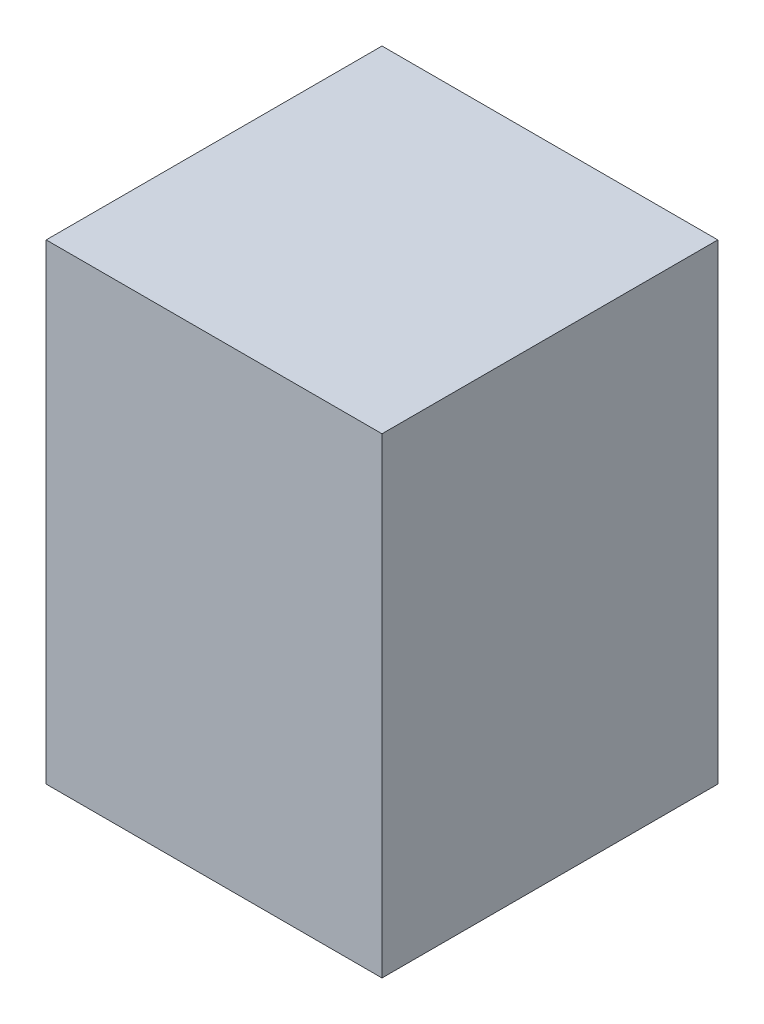
ISO-10303-21;
HEADER;
FILE_DESCRIPTION(('STEP AP214'),'2;1');
FILE_NAME('part.step','',(''),(''),'','','');
FILE_SCHEMA(('AUTOMOTIVE_DESIGN { 1 0 10303 214 1 1 1 1 }'));
ENDSEC;
DATA;
#1=APPLICATION_CONTEXT('core data for automotive mechanical design processes');
#2=APPLICATION_PROTOCOL_DEFINITION('international standard','automotive_design',2000,#1);
#3=PRODUCT_CONTEXT('',#1,'mechanical');
#4=PRODUCT('Part','Part','',(#3));
#5=PRODUCT_RELATED_PRODUCT_CATEGORY('part','',(#4));
#6=PRODUCT_DEFINITION_FORMATION('','',#4);
#7=PRODUCT_DEFINITION_CONTEXT('part definition',#1,'design');
#8=PRODUCT_DEFINITION('design','',#6,#7);
#9=PRODUCT_DEFINITION_SHAPE('','',#8);
#10=(LENGTH_UNIT() NAMED_UNIT(*) SI_UNIT(.MILLI.,.METRE.));
#11=(NAMED_UNIT(*) PLANE_ANGLE_UNIT() SI_UNIT($,.RADIAN.));
#12=(NAMED_UNIT(*) SI_UNIT($,.STERADIAN.) SOLID_ANGLE_UNIT());
#13=UNCERTAINTY_MEASURE_WITH_UNIT(LENGTH_MEASURE(1.E-05),#10,'distance_accuracy_value','');
#14=(GEOMETRIC_REPRESENTATION_CONTEXT(3) GLOBAL_UNCERTAINTY_ASSIGNED_CONTEXT((#13)) GLOBAL_UNIT_ASSIGNED_CONTEXT((#10,
#11,#12)) REPRESENTATION_CONTEXT('',''));
#15=CARTESIAN_POINT('',(0.,0.,0.));
#16=DIRECTION('',(0.,0.,1.));
#17=DIRECTION('',(1.,0.,0.));
#18=AXIS2_PLACEMENT_3D('',#15,#16,#17);
#19=CARTESIAN_POINT('',(322.,300.,-430.));
#20=DIRECTION('',(-1.,0.,0.));
#21=DIRECTION('',(0.,0.,1.));
#22=AXIS2_PLACEMENT_3D('',#19,#20,#21);
#23=PLANE('',#22);
#24=DIRECTION('',(0.,-1.,0.));
#25=VECTOR('',#24,1.);
#26=CARTESIAN_POINT('',(322.,300.,-373.));
#27=LINE('',#26,#25);
#28=CARTESIAN_POINT('',(322.,380.,-373.));
#29=VERTEX_POINT('',#28);
#30=CARTESIAN_POINT('',(322.,300.,-373.));
#31=VERTEX_POINT('',#30);
#32=EDGE_CURVE('E103',#29,#31,#27,.T.);
#33=ORIENTED_EDGE('',*,*,#32,.F.);
#34=DIRECTION('',(0.,0.,1.));
#35=VECTOR('',#34,1.);
#36=CARTESIAN_POINT('',(322.,380.,-430.));
#37=LINE('',#36,#35);
#38=CARTESIAN_POINT('',(322.,380.,-430.));
#39=VERTEX_POINT('',#38);
#40=EDGE_CURVE('E11',#39,#29,#37,.T.);
#41=ORIENTED_EDGE('',*,*,#40,.F.);
#42=DIRECTION('',(0.,-1.,0.));
#43=VECTOR('',#42,1.);
#44=CARTESIAN_POINT('',(322.,300.,-430.));
#45=LINE('',#44,#43);
#46=CARTESIAN_POINT('',(322.,300.,-430.));
#47=VERTEX_POINT('',#46);
#48=EDGE_CURVE('E97',#39,#47,#45,.T.);
#49=ORIENTED_EDGE('',*,*,#48,.T.);
#50=DIRECTION('',(0.,0.,1.));
#51=VECTOR('',#50,1.);
#52=CARTESIAN_POINT('',(322.,300.,-430.));
#53=LINE('',#52,#51);
#54=EDGE_CURVE('E42',#47,#31,#53,.T.);
#55=ORIENTED_EDGE('',*,*,#54,.T.);
#56=EDGE_LOOP('',(#33,#41,#49,#55));
#57=FACE_BOUND('',#56,.T.);
#58=ADVANCED_FACE('F39',(#57),#23,.T.);
#59=CARTESIAN_POINT('',(322.,380.,-430.));
#60=DIRECTION('',(0.,1.,0.));
#61=DIRECTION('',(0.,0.,1.));
#62=AXIS2_PLACEMENT_3D('',#59,#60,#61);
#63=PLANE('',#62);
#64=DIRECTION('',(-1.,0.,0.));
#65=VECTOR('',#64,1.);
#66=CARTESIAN_POINT('',(322.,380.,-373.));
#67=LINE('',#66,#65);
#68=CARTESIAN_POINT('',(379.,380.,-373.));
#69=VERTEX_POINT('',#68);
#70=EDGE_CURVE('E99',#69,#29,#67,.T.);
#71=ORIENTED_EDGE('',*,*,#70,.F.);
#72=DIRECTION('',(0.,0.,1.));
#73=VECTOR('',#72,1.);
#74=CARTESIAN_POINT('',(379.,380.,-430.));
#75=LINE('',#74,#73);
#76=CARTESIAN_POINT('',(379.,380.,-430.));
#77=VERTEX_POINT('',#76);
#78=EDGE_CURVE('E48',#77,#69,#75,.T.);
#79=ORIENTED_EDGE('',*,*,#78,.F.);
#80=DIRECTION('',(-1.,0.,0.));
#81=VECTOR('',#80,1.);
#82=CARTESIAN_POINT('',(322.,380.,-430.));
#83=LINE('',#82,#81);
#84=EDGE_CURVE('E94',#77,#39,#83,.T.);
#85=ORIENTED_EDGE('',*,*,#84,.T.);
#86=ORIENTED_EDGE('',*,*,#40,.T.);
#87=EDGE_LOOP('',(#71,#79,#85,#86));
#88=FACE_BOUND('',#87,.T.);
#89=ADVANCED_FACE('F113',(#88),#63,.T.);
#90=CARTESIAN_POINT('',(379.,300.,-430.));
#91=DIRECTION('',(1.,0.,0.));
#92=DIRECTION('',(0.,0.,-1.));
#93=AXIS2_PLACEMENT_3D('',#90,#91,#92);
#94=PLANE('',#93);
#95=DIRECTION('',(0.,1.,0.));
#96=VECTOR('',#95,1.);
#97=CARTESIAN_POINT('',(379.,300.,-373.));
#98=LINE('',#97,#96);
#99=CARTESIAN_POINT('',(379.,300.,-373.));
#100=VERTEX_POINT('',#99);
#101=EDGE_CURVE('E89',#100,#69,#98,.T.);
#102=ORIENTED_EDGE('',*,*,#101,.F.);
#103=DIRECTION('',(0.,0.,1.));
#104=VECTOR('',#103,1.);
#105=CARTESIAN_POINT('',(379.,300.,-430.));
#106=LINE('',#105,#104);
#107=CARTESIAN_POINT('',(379.,300.,-430.));
#108=VERTEX_POINT('',#107);
#109=EDGE_CURVE('E84',#108,#100,#106,.T.);
#110=ORIENTED_EDGE('',*,*,#109,.F.);
#111=DIRECTION('',(0.,1.,0.));
#112=VECTOR('',#111,1.);
#113=CARTESIAN_POINT('',(379.,300.,-430.));
#114=LINE('',#113,#112);
#115=EDGE_CURVE('E87',#108,#77,#114,.T.);
#116=ORIENTED_EDGE('',*,*,#115,.T.);
#117=ORIENTED_EDGE('',*,*,#78,.T.);
#118=EDGE_LOOP('',(#102,#110,#116,#117));
#119=FACE_BOUND('',#118,.T.);
#120=ADVANCED_FACE('F86',(#119),#94,.T.);
#121=CARTESIAN_POINT('',(322.,300.,-430.));
#122=DIRECTION('',(0.,-1.,0.));
#123=DIRECTION('',(0.,0.,-1.));
#124=AXIS2_PLACEMENT_3D('',#121,#122,#123);
#125=PLANE('',#124);
#126=DIRECTION('',(1.,0.,0.));
#127=VECTOR('',#126,1.);
#128=CARTESIAN_POINT('',(322.,300.,-373.));
#129=LINE('',#128,#127);
#130=EDGE_CURVE('E106',#31,#100,#129,.T.);
#131=ORIENTED_EDGE('',*,*,#130,.F.);
#132=ORIENTED_EDGE('',*,*,#54,.F.);
#133=DIRECTION('',(1.,0.,0.));
#134=VECTOR('',#133,1.);
#135=CARTESIAN_POINT('',(322.,300.,-430.));
#136=LINE('',#135,#134);
#137=EDGE_CURVE('E93',#47,#108,#136,.T.);
#138=ORIENTED_EDGE('',*,*,#137,.T.);
#139=ORIENTED_EDGE('',*,*,#109,.T.);
#140=EDGE_LOOP('',(#131,#132,#138,#139));
#141=FACE_BOUND('',#140,.T.);
#142=ADVANCED_FACE('F96',(#141),#125,.T.);
#143=CARTESIAN_POINT('',(0.,0.,-430.));
#144=DIRECTION('',(0.,0.,-1.));
#145=DIRECTION('',(-1.,0.,0.));
#146=AXIS2_PLACEMENT_3D('',#143,#144,#145);
#147=PLANE('',#146);
#148=ORIENTED_EDGE('',*,*,#48,.F.);
#149=ORIENTED_EDGE('',*,*,#84,.F.);
#150=ORIENTED_EDGE('',*,*,#115,.F.);
#151=ORIENTED_EDGE('',*,*,#137,.F.);
#152=EDGE_LOOP('',(#148,#149,#150,#151));
#153=FACE_BOUND('',#152,.T.);
#154=ADVANCED_FACE('F92',(#153),#147,.T.);
#155=CARTESIAN_POINT('',(0.,0.,-373.));
#156=DIRECTION('',(0.,0.,-1.));
#157=DIRECTION('',(-1.,0.,0.));
#158=AXIS2_PLACEMENT_3D('',#155,#156,#157);
#159=PLANE('',#158);
#160=ORIENTED_EDGE('',*,*,#32,.T.);
#161=ORIENTED_EDGE('',*,*,#130,.T.);
#162=ORIENTED_EDGE('',*,*,#101,.T.);
#163=ORIENTED_EDGE('',*,*,#70,.T.);
#164=EDGE_LOOP('',(#160,#161,#162,#163));
#165=FACE_BOUND('',#164,.T.);
#166=ADVANCED_FACE('F112',(#165),#159,.F.);
#167=CLOSED_SHELL('',(#58,#89,#120,#142,#154,#166));
#168=MANIFOLD_SOLID_BREP('B2',#167);
#169=ADVANCED_BREP_SHAPE_REPRESENTATION('',(#18,#168),#14);
#170=SHAPE_DEFINITION_REPRESENTATION(#9,#169);
ENDSEC;
END-ISO-10303-21;
